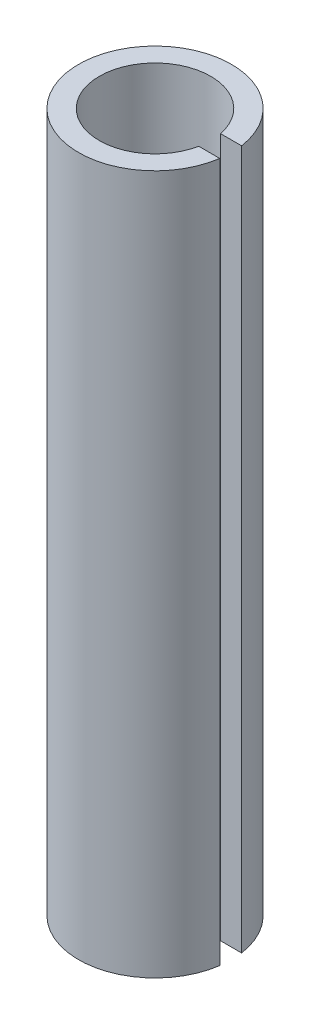
ISO-10303-21;
HEADER;
FILE_DESCRIPTION(('STEP AP214'),'2;1');
FILE_NAME('part.step','',(''),(''),'','','');
FILE_SCHEMA(('AUTOMOTIVE_DESIGN { 1 0 10303 214 1 1 1 1 }'));
ENDSEC;
DATA;
#1=APPLICATION_CONTEXT('core data for automotive mechanical design processes');
#2=APPLICATION_PROTOCOL_DEFINITION('international standard','automotive_design',2000,#1);
#3=PRODUCT_CONTEXT('',#1,'mechanical');
#4=PRODUCT('Part','Part','',(#3));
#5=PRODUCT_RELATED_PRODUCT_CATEGORY('part','',(#4));
#6=PRODUCT_DEFINITION_FORMATION('','',#4);
#7=PRODUCT_DEFINITION_CONTEXT('part definition',#1,'design');
#8=PRODUCT_DEFINITION('design','',#6,#7);
#9=PRODUCT_DEFINITION_SHAPE('','',#8);
#10=(LENGTH_UNIT() NAMED_UNIT(*) SI_UNIT(.MILLI.,.METRE.));
#11=(NAMED_UNIT(*) PLANE_ANGLE_UNIT() SI_UNIT($,.RADIAN.));
#12=(NAMED_UNIT(*) SI_UNIT($,.STERADIAN.) SOLID_ANGLE_UNIT());
#13=UNCERTAINTY_MEASURE_WITH_UNIT(LENGTH_MEASURE(1.E-05),#10,'distance_accuracy_value','');
#14=(GEOMETRIC_REPRESENTATION_CONTEXT(3) GLOBAL_UNCERTAINTY_ASSIGNED_CONTEXT((#13)) GLOBAL_UNIT_ASSIGNED_CONTEXT((#10,
#11,#12)) REPRESENTATION_CONTEXT('',''));
#15=CARTESIAN_POINT('',(0.,0.,0.));
#16=DIRECTION('',(0.,0.,1.));
#17=DIRECTION('',(1.,0.,0.));
#18=AXIS2_PLACEMENT_3D('',#15,#16,#17);
#19=CARTESIAN_POINT('',(0.,32.,0.));
#20=DIRECTION('',(0.,-1.,0.));
#21=DIRECTION('',(0.,0.,-1.));
#22=AXIS2_PLACEMENT_3D('',#19,#20,#21);
#23=CYLINDRICAL_SURFACE('',#22,2.55);
#24=CARTESIAN_POINT('',(0.,0.,0.));
#25=DIRECTION('',(0.,1.,0.));
#26=DIRECTION('',(0.,0.,1.));
#27=AXIS2_PLACEMENT_3D('',#24,#25,#26);
#28=CIRCLE('',#27,2.55);
#29=CARTESIAN_POINT('',(2.50049995001,0.,-0.5));
#30=VERTEX_POINT('',#29);
#31=CARTESIAN_POINT('',(2.50049995001,0.,0.5));
#32=VERTEX_POINT('',#31);
#33=EDGE_CURVE('E103',#30,#32,#28,.T.);
#34=ORIENTED_EDGE('',*,*,#33,.F.);
#35=DIRECTION('',(0.,-1.,0.));
#36=VECTOR('',#35,1.);
#37=CARTESIAN_POINT('',(2.50049995001,32.,-0.5));
#38=LINE('',#37,#36);
#39=CARTESIAN_POINT('',(2.50049995001,32.,-0.5));
#40=VERTEX_POINT('',#39);
#41=EDGE_CURVE('E11',#40,#30,#38,.T.);
#42=ORIENTED_EDGE('',*,*,#41,.F.);
#43=CARTESIAN_POINT('',(0.,32.,0.));
#44=DIRECTION('',(0.,1.,0.));
#45=DIRECTION('',(0.,0.,1.));
#46=AXIS2_PLACEMENT_3D('',#43,#44,#45);
#47=CIRCLE('',#46,2.55);
#48=CARTESIAN_POINT('',(2.50049995001,32.,0.5));
#49=VERTEX_POINT('',#48);
#50=EDGE_CURVE('E88',#40,#49,#47,.T.);
#51=ORIENTED_EDGE('',*,*,#50,.T.);
#52=DIRECTION('',(0.,-1.,0.));
#53=VECTOR('',#52,1.);
#54=CARTESIAN_POINT('',(2.50049995001,32.,0.5));
#55=LINE('',#54,#53);
#56=EDGE_CURVE('E56',#49,#32,#55,.T.);
#57=ORIENTED_EDGE('',*,*,#56,.T.);
#58=EDGE_LOOP('',(#34,#42,#51,#57));
#59=FACE_BOUND('',#58,.T.);
#60=ADVANCED_FACE('F40',(#59),#23,.F.);
#61=CARTESIAN_POINT('',(0.,32.,-0.5));
#62=DIRECTION('',(0.,0.,-1.));
#63=DIRECTION('',(-1.,0.,0.));
#64=AXIS2_PLACEMENT_3D('',#61,#62,#63);
#65=PLANE('',#64);
#66=DIRECTION('',(1.,0.,0.));
#67=VECTOR('',#66,1.);
#68=CARTESIAN_POINT('',(0.,0.,-0.5));
#69=LINE('',#68,#67);
#70=CARTESIAN_POINT('',(3.46410161513775,0.,-0.5));
#71=VERTEX_POINT('',#70);
#72=EDGE_CURVE('E94',#30,#71,#69,.T.);
#73=ORIENTED_EDGE('',*,*,#72,.T.);
#74=DIRECTION('',(0.,-1.,0.));
#75=VECTOR('',#74,1.);
#76=CARTESIAN_POINT('',(3.46410161513775,32.,-0.5));
#77=LINE('',#76,#75);
#78=CARTESIAN_POINT('',(3.46410161513775,32.,-0.5));
#79=VERTEX_POINT('',#78);
#80=EDGE_CURVE('E48',#79,#71,#77,.T.);
#81=ORIENTED_EDGE('',*,*,#80,.F.);
#82=DIRECTION('',(1.,0.,0.));
#83=VECTOR('',#82,1.);
#84=CARTESIAN_POINT('',(0.,32.,-0.5));
#85=LINE('',#84,#83);
#86=EDGE_CURVE('E82',#40,#79,#85,.T.);
#87=ORIENTED_EDGE('',*,*,#86,.F.);
#88=ORIENTED_EDGE('',*,*,#41,.T.);
#89=EDGE_LOOP('',(#73,#81,#87,#88));
#90=FACE_BOUND('',#89,.T.);
#91=ADVANCED_FACE('F92',(#90),#65,.F.);
#92=CARTESIAN_POINT('',(0.,32.,0.));
#93=DIRECTION('',(0.,-1.,0.));
#94=DIRECTION('',(0.,0.,-1.));
#95=AXIS2_PLACEMENT_3D('',#92,#93,#94);
#96=CYLINDRICAL_SURFACE('',#95,3.5);
#97=CARTESIAN_POINT('',(0.,0.,0.));
#98=DIRECTION('',(0.,1.,0.));
#99=DIRECTION('',(0.,0.,1.));
#100=AXIS2_PLACEMENT_3D('',#97,#98,#99);
#101=CIRCLE('',#100,3.5);
#102=CARTESIAN_POINT('',(3.46410161513775,0.,0.5));
#103=VERTEX_POINT('',#102);
#104=EDGE_CURVE('E106',#71,#103,#101,.T.);
#105=ORIENTED_EDGE('',*,*,#104,.T.);
#106=DIRECTION('',(0.,-1.,0.));
#107=VECTOR('',#106,1.);
#108=CARTESIAN_POINT('',(3.46410161513775,32.,0.5));
#109=LINE('',#108,#107);
#110=CARTESIAN_POINT('',(3.46410161513775,32.,0.5));
#111=VERTEX_POINT('',#110);
#112=EDGE_CURVE('E70',#111,#103,#109,.T.);
#113=ORIENTED_EDGE('',*,*,#112,.F.);
#114=CARTESIAN_POINT('',(0.,32.,0.));
#115=DIRECTION('',(0.,1.,0.));
#116=DIRECTION('',(0.,0.,1.));
#117=AXIS2_PLACEMENT_3D('',#114,#115,#116);
#118=CIRCLE('',#117,3.5);
#119=EDGE_CURVE('E87',#79,#111,#118,.T.);
#120=ORIENTED_EDGE('',*,*,#119,.F.);
#121=ORIENTED_EDGE('',*,*,#80,.T.);
#122=EDGE_LOOP('',(#105,#113,#120,#121));
#123=FACE_BOUND('',#122,.T.);
#124=ADVANCED_FACE('F97',(#123),#96,.T.);
#125=CARTESIAN_POINT('',(0.,32.,0.5));
#126=DIRECTION('',(0.,0.,-1.));
#127=DIRECTION('',(-1.,0.,0.));
#128=AXIS2_PLACEMENT_3D('',#125,#126,#127);
#129=PLANE('',#128);
#130=DIRECTION('',(1.,0.,0.));
#131=VECTOR('',#130,1.);
#132=CARTESIAN_POINT('',(0.,0.,0.5));
#133=LINE('',#132,#131);
#134=EDGE_CURVE('E108',#32,#103,#133,.T.);
#135=ORIENTED_EDGE('',*,*,#134,.F.);
#136=ORIENTED_EDGE('',*,*,#56,.F.);
#137=DIRECTION('',(1.,0.,0.));
#138=VECTOR('',#137,1.);
#139=CARTESIAN_POINT('',(0.,32.,0.5));
#140=LINE('',#139,#138);
#141=EDGE_CURVE('E98',#49,#111,#140,.T.);
#142=ORIENTED_EDGE('',*,*,#141,.T.);
#143=ORIENTED_EDGE('',*,*,#112,.T.);
#144=EDGE_LOOP('',(#135,#136,#142,#143));
#145=FACE_BOUND('',#144,.T.);
#146=ADVANCED_FACE('F113',(#145),#129,.T.);
#147=CARTESIAN_POINT('',(0.,32.,0.));
#148=DIRECTION('',(0.,1.,0.));
#149=DIRECTION('',(0.,0.,1.));
#150=AXIS2_PLACEMENT_3D('',#147,#148,#149);
#151=PLANE('',#150);
#152=ORIENTED_EDGE('',*,*,#50,.F.);
#153=ORIENTED_EDGE('',*,*,#86,.T.);
#154=ORIENTED_EDGE('',*,*,#119,.T.);
#155=ORIENTED_EDGE('',*,*,#141,.F.);
#156=EDGE_LOOP('',(#152,#153,#154,#155));
#157=FACE_BOUND('',#156,.T.);
#158=ADVANCED_FACE('F84',(#157),#151,.T.);
#159=CARTESIAN_POINT('',(0.,0.,0.));
#160=DIRECTION('',(0.,1.,0.));
#161=DIRECTION('',(0.,0.,1.));
#162=AXIS2_PLACEMENT_3D('',#159,#160,#161);
#163=PLANE('',#162);
#164=ORIENTED_EDGE('',*,*,#33,.T.);
#165=ORIENTED_EDGE('',*,*,#134,.T.);
#166=ORIENTED_EDGE('',*,*,#104,.F.);
#167=ORIENTED_EDGE('',*,*,#72,.F.);
#168=EDGE_LOOP('',(#164,#165,#166,#167));
#169=FACE_BOUND('',#168,.T.);
#170=ADVANCED_FACE('F120',(#169),#163,.F.);
#171=CLOSED_SHELL('',(#60,#91,#124,#146,#158,#170));
#172=MANIFOLD_SOLID_BREP('B2',#171);
#173=ADVANCED_BREP_SHAPE_REPRESENTATION('',(#18,#172),#14);
#174=SHAPE_DEFINITION_REPRESENTATION(#9,#173);
ENDSEC;
END-ISO-10303-21;
